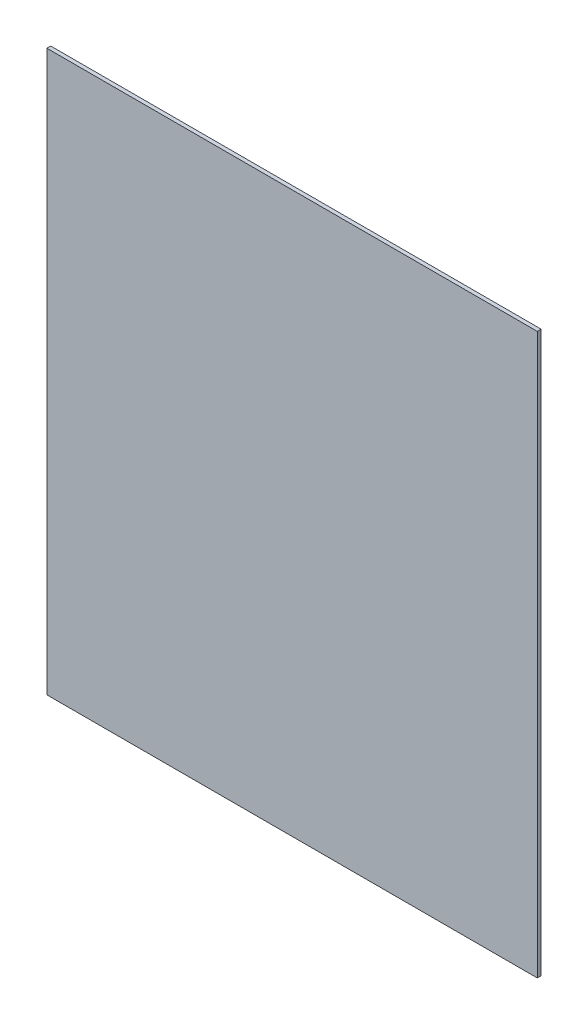
ISO-10303-21;
HEADER;
FILE_DESCRIPTION(('STEP AP214'),'2;1');
FILE_NAME('part.step','',(''),(''),'','','');
FILE_SCHEMA(('AUTOMOTIVE_DESIGN { 1 0 10303 214 1 1 1 1 }'));
ENDSEC;
DATA;
#1=APPLICATION_CONTEXT('core data for automotive mechanical design processes');
#2=APPLICATION_PROTOCOL_DEFINITION('international standard','automotive_design',2000,#1);
#3=PRODUCT_CONTEXT('',#1,'mechanical');
#4=PRODUCT('Part','Part','',(#3));
#5=PRODUCT_RELATED_PRODUCT_CATEGORY('part','',(#4));
#6=PRODUCT_DEFINITION_FORMATION('','',#4);
#7=PRODUCT_DEFINITION_CONTEXT('part definition',#1,'design');
#8=PRODUCT_DEFINITION('design','',#6,#7);
#9=PRODUCT_DEFINITION_SHAPE('','',#8);
#10=(LENGTH_UNIT() NAMED_UNIT(*) SI_UNIT(.MILLI.,.METRE.));
#11=(NAMED_UNIT(*) PLANE_ANGLE_UNIT() SI_UNIT($,.RADIAN.));
#12=(NAMED_UNIT(*) SI_UNIT($,.STERADIAN.) SOLID_ANGLE_UNIT());
#13=UNCERTAINTY_MEASURE_WITH_UNIT(LENGTH_MEASURE(1.E-05),#10,'distance_accuracy_value','');
#14=(GEOMETRIC_REPRESENTATION_CONTEXT(3) GLOBAL_UNCERTAINTY_ASSIGNED_CONTEXT((#13)) GLOBAL_UNIT_ASSIGNED_CONTEXT((#10,
#11,#12)) REPRESENTATION_CONTEXT('',''));
#15=CARTESIAN_POINT('',(0.,0.,0.));
#16=DIRECTION('',(0.,0.,1.));
#17=DIRECTION('',(1.,0.,0.));
#18=AXIS2_PLACEMENT_3D('',#15,#16,#17);
#19=CARTESIAN_POINT('',(416.,-475.,6.5));
#20=DIRECTION('',(-1.,0.,0.));
#21=DIRECTION('',(0.,0.,1.));
#22=AXIS2_PLACEMENT_3D('',#19,#20,#21);
#23=PLANE('',#22);
#24=DIRECTION('',(0.,1.,0.));
#25=VECTOR('',#24,1.);
#26=CARTESIAN_POINT('',(416.,-475.,0.));
#27=LINE('',#26,#25);
#28=CARTESIAN_POINT('',(416.,-475.,0.));
#29=VERTEX_POINT('',#28);
#30=CARTESIAN_POINT('',(416.,475.,0.));
#31=VERTEX_POINT('',#30);
#32=EDGE_CURVE('E95',#29,#31,#27,.T.);
#33=ORIENTED_EDGE('',*,*,#32,.T.);
#34=DIRECTION('',(0.,0.,-1.));
#35=VECTOR('',#34,1.);
#36=CARTESIAN_POINT('',(416.,475.,6.5));
#37=LINE('',#36,#35);
#38=CARTESIAN_POINT('',(416.,475.,6.5));
#39=VERTEX_POINT('',#38);
#40=EDGE_CURVE('E11',#39,#31,#37,.T.);
#41=ORIENTED_EDGE('',*,*,#40,.F.);
#42=DIRECTION('',(0.,1.,0.));
#43=VECTOR('',#42,1.);
#44=CARTESIAN_POINT('',(416.,-475.,6.5));
#45=LINE('',#44,#43);
#46=CARTESIAN_POINT('',(416.,-475.,6.5));
#47=VERTEX_POINT('',#46);
#48=EDGE_CURVE('E83',#47,#39,#45,.T.);
#49=ORIENTED_EDGE('',*,*,#48,.F.);
#50=DIRECTION('',(0.,0.,-1.));
#51=VECTOR('',#50,1.);
#52=CARTESIAN_POINT('',(416.,-475.,6.5));
#53=LINE('',#52,#51);
#54=EDGE_CURVE('E91',#47,#29,#53,.T.);
#55=ORIENTED_EDGE('',*,*,#54,.T.);
#56=EDGE_LOOP('',(#33,#41,#49,#55));
#57=FACE_BOUND('',#56,.T.);
#58=ADVANCED_FACE('F32',(#57),#23,.F.);
#59=CARTESIAN_POINT('',(-416.,475.,6.5));
#60=DIRECTION('',(0.,-1.,0.));
#61=DIRECTION('',(0.,0.,-1.));
#62=AXIS2_PLACEMENT_3D('',#59,#60,#61);
#63=PLANE('',#62);
#64=DIRECTION('',(-1.,0.,0.));
#65=VECTOR('',#64,1.);
#66=CARTESIAN_POINT('',(-416.,475.,0.));
#67=LINE('',#66,#65);
#68=CARTESIAN_POINT('',(-416.,475.,0.));
#69=VERTEX_POINT('',#68);
#70=EDGE_CURVE('E87',#31,#69,#67,.T.);
#71=ORIENTED_EDGE('',*,*,#70,.T.);
#72=DIRECTION('',(0.,0.,-1.));
#73=VECTOR('',#72,1.);
#74=CARTESIAN_POINT('',(-416.,475.,6.5));
#75=LINE('',#74,#73);
#76=CARTESIAN_POINT('',(-416.,475.,6.5));
#77=VERTEX_POINT('',#76);
#78=EDGE_CURVE('E40',#77,#69,#75,.T.);
#79=ORIENTED_EDGE('',*,*,#78,.F.);
#80=DIRECTION('',(-1.,0.,0.));
#81=VECTOR('',#80,1.);
#82=CARTESIAN_POINT('',(-416.,475.,6.5));
#83=LINE('',#82,#81);
#84=EDGE_CURVE('E78',#39,#77,#83,.T.);
#85=ORIENTED_EDGE('',*,*,#84,.F.);
#86=ORIENTED_EDGE('',*,*,#40,.T.);
#87=EDGE_LOOP('',(#71,#79,#85,#86));
#88=FACE_BOUND('',#87,.T.);
#89=ADVANCED_FACE('F86',(#88),#63,.F.);
#90=CARTESIAN_POINT('',(-416.,-475.,6.5));
#91=DIRECTION('',(1.,0.,0.));
#92=DIRECTION('',(0.,0.,-1.));
#93=AXIS2_PLACEMENT_3D('',#90,#91,#92);
#94=PLANE('',#93);
#95=DIRECTION('',(0.,-1.,0.));
#96=VECTOR('',#95,1.);
#97=CARTESIAN_POINT('',(-416.,-475.,0.));
#98=LINE('',#97,#96);
#99=CARTESIAN_POINT('',(-416.,-475.,0.));
#100=VERTEX_POINT('',#99);
#101=EDGE_CURVE('E65',#69,#100,#98,.T.);
#102=ORIENTED_EDGE('',*,*,#101,.T.);
#103=DIRECTION('',(0.,0.,-1.));
#104=VECTOR('',#103,1.);
#105=CARTESIAN_POINT('',(-416.,-475.,6.5));
#106=LINE('',#105,#104);
#107=CARTESIAN_POINT('',(-416.,-475.,6.5));
#108=VERTEX_POINT('',#107);
#109=EDGE_CURVE('E88',#108,#100,#106,.T.);
#110=ORIENTED_EDGE('',*,*,#109,.F.);
#111=DIRECTION('',(0.,-1.,0.));
#112=VECTOR('',#111,1.);
#113=CARTESIAN_POINT('',(-416.,-475.,6.5));
#114=LINE('',#113,#112);
#115=EDGE_CURVE('E81',#77,#108,#114,.T.);
#116=ORIENTED_EDGE('',*,*,#115,.F.);
#117=ORIENTED_EDGE('',*,*,#78,.T.);
#118=EDGE_LOOP('',(#102,#110,#116,#117));
#119=FACE_BOUND('',#118,.T.);
#120=ADVANCED_FACE('F89',(#119),#94,.F.);
#121=CARTESIAN_POINT('',(-416.,-475.,6.5));
#122=DIRECTION('',(0.,1.,0.));
#123=DIRECTION('',(0.,0.,1.));
#124=AXIS2_PLACEMENT_3D('',#121,#122,#123);
#125=PLANE('',#124);
#126=DIRECTION('',(1.,0.,0.));
#127=VECTOR('',#126,1.);
#128=CARTESIAN_POINT('',(-416.,-475.,0.));
#129=LINE('',#128,#127);
#130=EDGE_CURVE('E71',#100,#29,#129,.T.);
#131=ORIENTED_EDGE('',*,*,#130,.T.);
#132=ORIENTED_EDGE('',*,*,#54,.F.);
#133=DIRECTION('',(1.,0.,0.));
#134=VECTOR('',#133,1.);
#135=CARTESIAN_POINT('',(-416.,-475.,6.5));
#136=LINE('',#135,#134);
#137=EDGE_CURVE('E48',#108,#47,#136,.T.);
#138=ORIENTED_EDGE('',*,*,#137,.F.);
#139=ORIENTED_EDGE('',*,*,#109,.T.);
#140=EDGE_LOOP('',(#131,#132,#138,#139));
#141=FACE_BOUND('',#140,.T.);
#142=ADVANCED_FACE('F102',(#141),#125,.F.);
#143=CARTESIAN_POINT('',(0.,0.,6.5));
#144=DIRECTION('',(0.,0.,-1.));
#145=DIRECTION('',(-1.,0.,0.));
#146=AXIS2_PLACEMENT_3D('',#143,#144,#145);
#147=PLANE('',#146);
#148=ORIENTED_EDGE('',*,*,#48,.T.);
#149=ORIENTED_EDGE('',*,*,#84,.T.);
#150=ORIENTED_EDGE('',*,*,#115,.T.);
#151=ORIENTED_EDGE('',*,*,#137,.T.);
#152=EDGE_LOOP('',(#148,#149,#150,#151));
#153=FACE_BOUND('',#152,.T.);
#154=ADVANCED_FACE('F79',(#153),#147,.F.);
#155=CARTESIAN_POINT('',(0.,0.,0.));
#156=DIRECTION('',(0.,0.,-1.));
#157=DIRECTION('',(-1.,0.,0.));
#158=AXIS2_PLACEMENT_3D('',#155,#156,#157);
#159=PLANE('',#158);
#160=ORIENTED_EDGE('',*,*,#32,.F.);
#161=ORIENTED_EDGE('',*,*,#130,.F.);
#162=ORIENTED_EDGE('',*,*,#101,.F.);
#163=ORIENTED_EDGE('',*,*,#70,.F.);
#164=EDGE_LOOP('',(#160,#161,#162,#163));
#165=FACE_BOUND('',#164,.T.);
#166=ADVANCED_FACE('F105',(#165),#159,.T.);
#167=CLOSED_SHELL('',(#58,#89,#120,#142,#154,#166));
#168=MANIFOLD_SOLID_BREP('B2',#167);
#169=ADVANCED_BREP_SHAPE_REPRESENTATION('',(#18,#168),#14);
#170=SHAPE_DEFINITION_REPRESENTATION(#9,#169);
ENDSEC;
END-ISO-10303-21;
